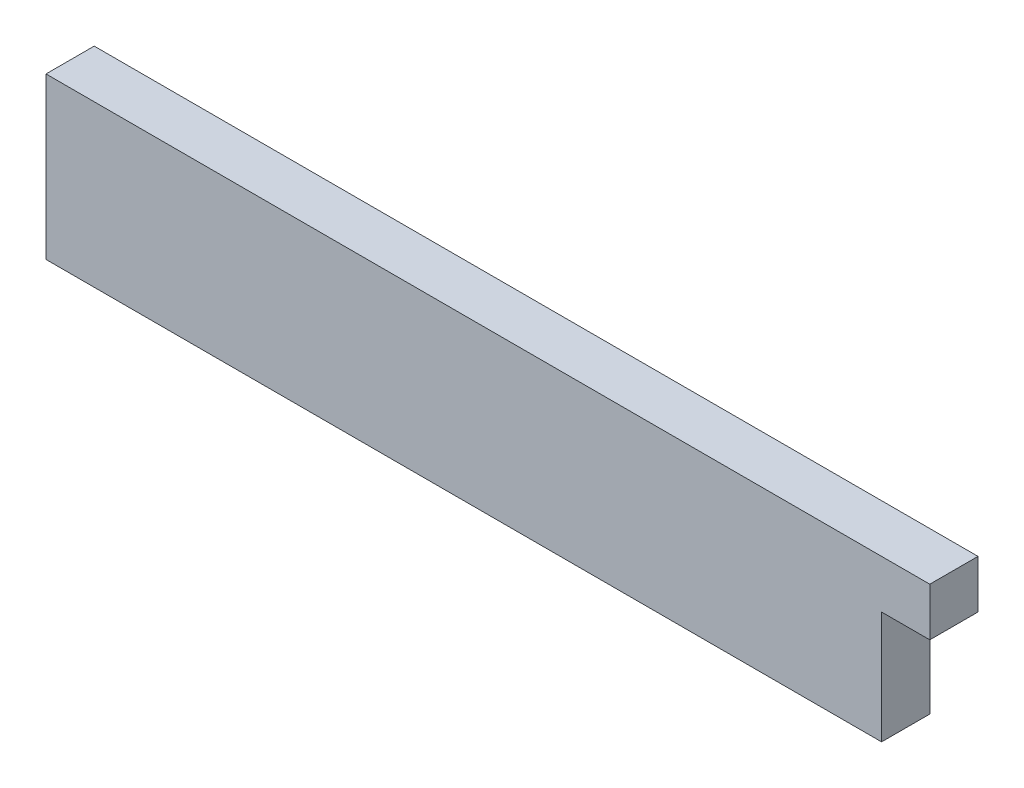
ISO-10303-21;
HEADER;
FILE_DESCRIPTION(('STEP AP214'),'2;1');
FILE_NAME('part.step','',(''),(''),'','','');
FILE_SCHEMA(('AUTOMOTIVE_DESIGN { 1 0 10303 214 1 1 1 1 }'));
ENDSEC;
DATA;
#1=APPLICATION_CONTEXT('core data for automotive mechanical design processes');
#2=APPLICATION_PROTOCOL_DEFINITION('international standard','automotive_design',2000,#1);
#3=PRODUCT_CONTEXT('',#1,'mechanical');
#4=PRODUCT('Part','Part','',(#3));
#5=PRODUCT_RELATED_PRODUCT_CATEGORY('part','',(#4));
#6=PRODUCT_DEFINITION_FORMATION('','',#4);
#7=PRODUCT_DEFINITION_CONTEXT('part definition',#1,'design');
#8=PRODUCT_DEFINITION('design','',#6,#7);
#9=PRODUCT_DEFINITION_SHAPE('','',#8);
#10=(LENGTH_UNIT() NAMED_UNIT(*) SI_UNIT(.MILLI.,.METRE.));
#11=(NAMED_UNIT(*) PLANE_ANGLE_UNIT() SI_UNIT($,.RADIAN.));
#12=(NAMED_UNIT(*) SI_UNIT($,.STERADIAN.) SOLID_ANGLE_UNIT());
#13=UNCERTAINTY_MEASURE_WITH_UNIT(LENGTH_MEASURE(1.E-05),#10,'distance_accuracy_value','');
#14=(GEOMETRIC_REPRESENTATION_CONTEXT(3) GLOBAL_UNCERTAINTY_ASSIGNED_CONTEXT((#13)) GLOBAL_UNIT_ASSIGNED_CONTEXT((#10,
#11,#12)) REPRESENTATION_CONTEXT('',''));
#15=CARTESIAN_POINT('',(0.,0.,0.));
#16=DIRECTION('',(0.,0.,1.));
#17=DIRECTION('',(1.,0.,0.));
#18=AXIS2_PLACEMENT_3D('',#15,#16,#17);
#19=CARTESIAN_POINT('',(0.,0.,3.));
#20=DIRECTION('',(1.,0.,0.));
#21=DIRECTION('',(0.,0.,-1.));
#22=AXIS2_PLACEMENT_3D('',#19,#20,#21);
#23=PLANE('',#22);
#24=DIRECTION('',(0.,-1.,0.));
#25=VECTOR('',#24,1.);
#26=CARTESIAN_POINT('',(0.,0.,0.));
#27=LINE('',#26,#25);
#28=CARTESIAN_POINT('',(0.,10.,0.));
#29=VERTEX_POINT('',#28);
#30=CARTESIAN_POINT('',(0.,0.,0.));
#31=VERTEX_POINT('',#30);
#32=EDGE_CURVE('E120',#29,#31,#27,.T.);
#33=ORIENTED_EDGE('',*,*,#32,.T.);
#34=DIRECTION('',(0.,0.,-1.));
#35=VECTOR('',#34,1.);
#36=CARTESIAN_POINT('',(0.,0.,3.));
#37=LINE('',#36,#35);
#38=CARTESIAN_POINT('',(0.,0.,3.));
#39=VERTEX_POINT('',#38);
#40=EDGE_CURVE('E11',#39,#31,#37,.T.);
#41=ORIENTED_EDGE('',*,*,#40,.F.);
#42=DIRECTION('',(0.,-1.,0.));
#43=VECTOR('',#42,1.);
#44=CARTESIAN_POINT('',(0.,0.,3.));
#45=LINE('',#44,#43);
#46=CARTESIAN_POINT('',(0.,10.,3.));
#47=VERTEX_POINT('',#46);
#48=EDGE_CURVE('E131',#47,#39,#45,.T.);
#49=ORIENTED_EDGE('',*,*,#48,.F.);
#50=DIRECTION('',(0.,0.,-1.));
#51=VECTOR('',#50,1.);
#52=CARTESIAN_POINT('',(0.,10.,3.));
#53=LINE('',#52,#51);
#54=EDGE_CURVE('E116',#47,#29,#53,.T.);
#55=ORIENTED_EDGE('',*,*,#54,.T.);
#56=EDGE_LOOP('',(#33,#41,#49,#55));
#57=FACE_BOUND('',#56,.T.);
#58=ADVANCED_FACE('F35',(#57),#23,.F.);
#59=CARTESIAN_POINT('',(0.,0.,3.));
#60=DIRECTION('',(0.,1.,0.));
#61=DIRECTION('',(0.,0.,1.));
#62=AXIS2_PLACEMENT_3D('',#59,#60,#61);
#63=PLANE('',#62);
#64=DIRECTION('',(1.,0.,0.));
#65=VECTOR('',#64,1.);
#66=CARTESIAN_POINT('',(0.,0.,0.));
#67=LINE('',#66,#65);
#68=CARTESIAN_POINT('',(52.,0.,0.));
#69=VERTEX_POINT('',#68);
#70=EDGE_CURVE('E123',#31,#69,#67,.T.);
#71=ORIENTED_EDGE('',*,*,#70,.T.);
#72=DIRECTION('',(0.,0.,-1.));
#73=VECTOR('',#72,1.);
#74=CARTESIAN_POINT('',(52.,0.,3.));
#75=LINE('',#74,#73);
#76=CARTESIAN_POINT('',(52.,0.,3.));
#77=VERTEX_POINT('',#76);
#78=EDGE_CURVE('E43',#77,#69,#75,.T.);
#79=ORIENTED_EDGE('',*,*,#78,.F.);
#80=DIRECTION('',(1.,0.,0.));
#81=VECTOR('',#80,1.);
#82=CARTESIAN_POINT('',(0.,0.,3.));
#83=LINE('',#82,#81);
#84=EDGE_CURVE('E86',#39,#77,#83,.T.);
#85=ORIENTED_EDGE('',*,*,#84,.F.);
#86=ORIENTED_EDGE('',*,*,#40,.T.);
#87=EDGE_LOOP('',(#71,#79,#85,#86));
#88=FACE_BOUND('',#87,.T.);
#89=ADVANCED_FACE('F145',(#88),#63,.F.);
#90=CARTESIAN_POINT('',(52.,0.,3.));
#91=DIRECTION('',(-1.,0.,0.));
#92=DIRECTION('',(0.,0.,1.));
#93=AXIS2_PLACEMENT_3D('',#90,#91,#92);
#94=PLANE('',#93);
#95=DIRECTION('',(0.,1.,0.));
#96=VECTOR('',#95,1.);
#97=CARTESIAN_POINT('',(52.,0.,0.));
#98=LINE('',#97,#96);
#99=CARTESIAN_POINT('',(52.,7.,0.));
#100=VERTEX_POINT('',#99);
#101=EDGE_CURVE('E125',#69,#100,#98,.T.);
#102=ORIENTED_EDGE('',*,*,#101,.T.);
#103=DIRECTION('',(0.,0.,-1.));
#104=VECTOR('',#103,1.);
#105=CARTESIAN_POINT('',(52.,7.,3.));
#106=LINE('',#105,#104);
#107=CARTESIAN_POINT('',(52.,7.,3.));
#108=VERTEX_POINT('',#107);
#109=EDGE_CURVE('E111',#108,#100,#106,.T.);
#110=ORIENTED_EDGE('',*,*,#109,.F.);
#111=DIRECTION('',(0.,1.,0.));
#112=VECTOR('',#111,1.);
#113=CARTESIAN_POINT('',(52.,0.,3.));
#114=LINE('',#113,#112);
#115=EDGE_CURVE('E100',#77,#108,#114,.T.);
#116=ORIENTED_EDGE('',*,*,#115,.F.);
#117=ORIENTED_EDGE('',*,*,#78,.T.);
#118=EDGE_LOOP('',(#102,#110,#116,#117));
#119=FACE_BOUND('',#118,.T.);
#120=ADVANCED_FACE('F137',(#119),#94,.F.);
#121=CARTESIAN_POINT('',(55.,7.,3.));
#122=DIRECTION('',(0.,1.,0.));
#123=DIRECTION('',(-1.,0.,0.));
#124=AXIS2_PLACEMENT_3D('',#121,#122,#123);
#125=PLANE('',#124);
#126=DIRECTION('',(1.,0.,0.));
#127=VECTOR('',#126,1.);
#128=CARTESIAN_POINT('',(55.,7.,0.));
#129=LINE('',#128,#127);
#130=CARTESIAN_POINT('',(55.,7.,0.));
#131=VERTEX_POINT('',#130);
#132=EDGE_CURVE('E109',#100,#131,#129,.T.);
#133=ORIENTED_EDGE('',*,*,#132,.T.);
#134=DIRECTION('',(0.,0.,-1.));
#135=VECTOR('',#134,1.);
#136=CARTESIAN_POINT('',(55.,7.,3.));
#137=LINE('',#136,#135);
#138=CARTESIAN_POINT('',(55.,7.,3.));
#139=VERTEX_POINT('',#138);
#140=EDGE_CURVE('E106',#139,#131,#137,.T.);
#141=ORIENTED_EDGE('',*,*,#140,.F.);
#142=DIRECTION('',(1.,0.,0.));
#143=VECTOR('',#142,1.);
#144=CARTESIAN_POINT('',(55.,7.,3.));
#145=LINE('',#144,#143);
#146=EDGE_CURVE('E93',#108,#139,#145,.T.);
#147=ORIENTED_EDGE('',*,*,#146,.F.);
#148=ORIENTED_EDGE('',*,*,#109,.T.);
#149=EDGE_LOOP('',(#133,#141,#147,#148));
#150=FACE_BOUND('',#149,.T.);
#151=ADVANCED_FACE('F107',(#150),#125,.F.);
#152=CARTESIAN_POINT('',(55.,10.,3.));
#153=DIRECTION('',(-1.,0.,0.));
#154=DIRECTION('',(0.,0.,1.));
#155=AXIS2_PLACEMENT_3D('',#152,#153,#154);
#156=PLANE('',#155);
#157=DIRECTION('',(0.,1.,0.));
#158=VECTOR('',#157,1.);
#159=CARTESIAN_POINT('',(55.,10.,0.));
#160=LINE('',#159,#158);
#161=CARTESIAN_POINT('',(55.,10.,0.));
#162=VERTEX_POINT('',#161);
#163=EDGE_CURVE('E128',#131,#162,#160,.T.);
#164=ORIENTED_EDGE('',*,*,#163,.T.);
#165=DIRECTION('',(0.,0.,-1.));
#166=VECTOR('',#165,1.);
#167=CARTESIAN_POINT('',(55.,10.,3.));
#168=LINE('',#167,#166);
#169=CARTESIAN_POINT('',(55.,10.,3.));
#170=VERTEX_POINT('',#169);
#171=EDGE_CURVE('E112',#170,#162,#168,.T.);
#172=ORIENTED_EDGE('',*,*,#171,.F.);
#173=DIRECTION('',(0.,1.,0.));
#174=VECTOR('',#173,1.);
#175=CARTESIAN_POINT('',(55.,10.,3.));
#176=LINE('',#175,#174);
#177=EDGE_CURVE('E97',#139,#170,#176,.T.);
#178=ORIENTED_EDGE('',*,*,#177,.F.);
#179=ORIENTED_EDGE('',*,*,#140,.T.);
#180=EDGE_LOOP('',(#164,#172,#178,#179));
#181=FACE_BOUND('',#180,.T.);
#182=ADVANCED_FACE('F114',(#181),#156,.F.);
#183=CARTESIAN_POINT('',(0.,10.,3.));
#184=DIRECTION('',(0.,-1.,0.));
#185=DIRECTION('',(0.,0.,-1.));
#186=AXIS2_PLACEMENT_3D('',#183,#184,#185);
#187=PLANE('',#186);
#188=DIRECTION('',(-1.,0.,0.));
#189=VECTOR('',#188,1.);
#190=CARTESIAN_POINT('',(0.,10.,0.));
#191=LINE('',#190,#189);
#192=EDGE_CURVE('E74',#162,#29,#191,.T.);
#193=ORIENTED_EDGE('',*,*,#192,.T.);
#194=ORIENTED_EDGE('',*,*,#54,.F.);
#195=DIRECTION('',(-1.,0.,0.));
#196=VECTOR('',#195,1.);
#197=CARTESIAN_POINT('',(42.,10.,3.));
#198=LINE('',#197,#196);
#199=EDGE_CURVE('E51',#170,#47,#198,.T.);
#200=ORIENTED_EDGE('',*,*,#199,.F.);
#201=ORIENTED_EDGE('',*,*,#171,.T.);
#202=EDGE_LOOP('',(#193,#194,#200,#201));
#203=FACE_BOUND('',#202,.T.);
#204=ADVANCED_FACE('F139',(#203),#187,.F.);
#205=CARTESIAN_POINT('',(0.,0.,3.));
#206=DIRECTION('',(0.,0.,-1.));
#207=DIRECTION('',(-1.,0.,0.));
#208=AXIS2_PLACEMENT_3D('',#205,#206,#207);
#209=PLANE('',#208);
#210=ORIENTED_EDGE('',*,*,#48,.T.);
#211=ORIENTED_EDGE('',*,*,#84,.T.);
#212=ORIENTED_EDGE('',*,*,#115,.T.);
#213=ORIENTED_EDGE('',*,*,#146,.T.);
#214=ORIENTED_EDGE('',*,*,#177,.T.);
#215=ORIENTED_EDGE('',*,*,#199,.T.);
#216=EDGE_LOOP('',(#210,#211,#212,#213,#214,#215));
#217=FACE_BOUND('',#216,.T.);
#218=ADVANCED_FACE('F95',(#217),#209,.F.);
#219=CARTESIAN_POINT('',(0.,0.,0.));
#220=DIRECTION('',(0.,0.,-1.));
#221=DIRECTION('',(-1.,0.,0.));
#222=AXIS2_PLACEMENT_3D('',#219,#220,#221);
#223=PLANE('',#222);
#224=ORIENTED_EDGE('',*,*,#32,.F.);
#225=ORIENTED_EDGE('',*,*,#192,.F.);
#226=ORIENTED_EDGE('',*,*,#163,.F.);
#227=ORIENTED_EDGE('',*,*,#132,.F.);
#228=ORIENTED_EDGE('',*,*,#101,.F.);
#229=ORIENTED_EDGE('',*,*,#70,.F.);
#230=EDGE_LOOP('',(#224,#225,#226,#227,#228,#229));
#231=FACE_BOUND('',#230,.T.);
#232=ADVANCED_FACE('F138',(#231),#223,.T.);
#233=CLOSED_SHELL('',(#58,#89,#120,#151,#182,#204,#218,#232));
#234=MANIFOLD_SOLID_BREP('B2',#233);
#235=ADVANCED_BREP_SHAPE_REPRESENTATION('',(#18,#234),#14);
#236=SHAPE_DEFINITION_REPRESENTATION(#9,#235);
ENDSEC;
END-ISO-10303-21;
